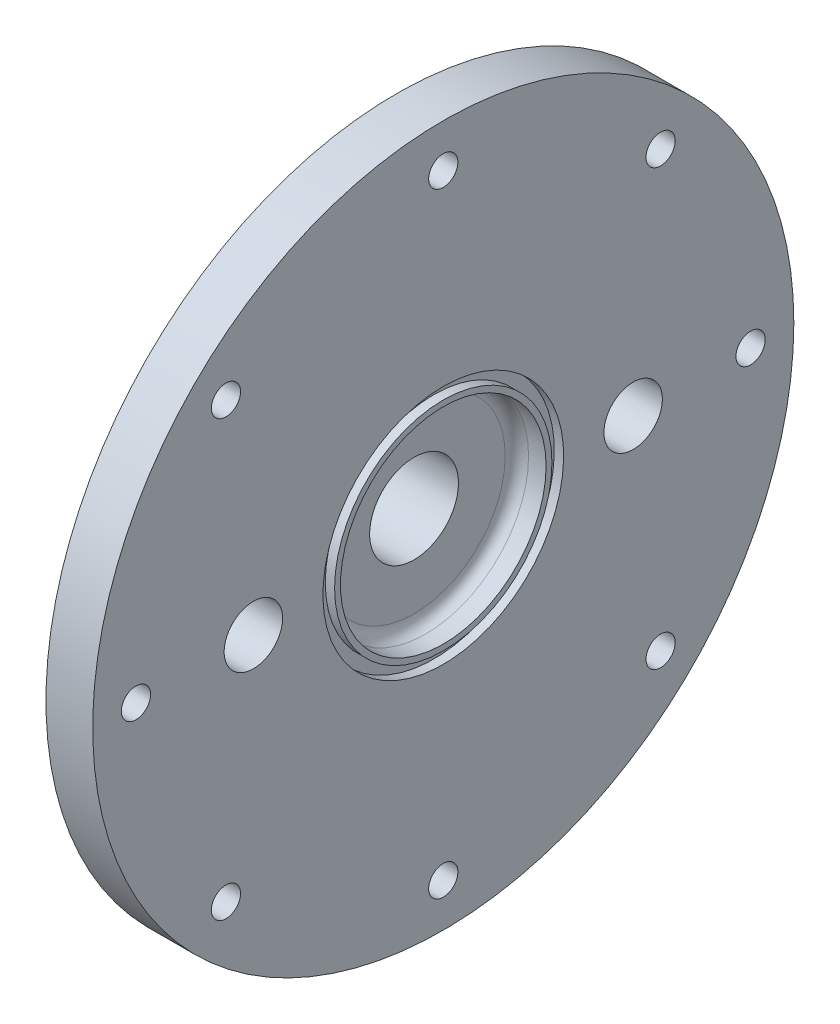
ISO-10303-21;
HEADER;
FILE_DESCRIPTION(('STEP AP214'),'2;1');
FILE_NAME('part.step','',(''),(''),'','','');
FILE_SCHEMA(('AUTOMOTIVE_DESIGN { 1 0 10303 214 1 1 1 1 }'));
ENDSEC;
DATA;
#1=APPLICATION_CONTEXT('core data for automotive mechanical design processes');
#2=APPLICATION_PROTOCOL_DEFINITION('international standard','automotive_design',2000,#1);
#3=PRODUCT_CONTEXT('',#1,'mechanical');
#4=PRODUCT('Part','Part','',(#3));
#5=PRODUCT_RELATED_PRODUCT_CATEGORY('part','',(#4));
#6=PRODUCT_DEFINITION_FORMATION('','',#4);
#7=PRODUCT_DEFINITION_CONTEXT('part definition',#1,'design');
#8=PRODUCT_DEFINITION('design','',#6,#7);
#9=PRODUCT_DEFINITION_SHAPE('','',#8);
#10=(LENGTH_UNIT() NAMED_UNIT(*) SI_UNIT(.MILLI.,.METRE.));
#11=(NAMED_UNIT(*) PLANE_ANGLE_UNIT() SI_UNIT($,.RADIAN.));
#12=(NAMED_UNIT(*) SI_UNIT($,.STERADIAN.) SOLID_ANGLE_UNIT());
#13=UNCERTAINTY_MEASURE_WITH_UNIT(LENGTH_MEASURE(1.E-05),#10,'distance_accuracy_value','');
#14=(GEOMETRIC_REPRESENTATION_CONTEXT(3) GLOBAL_UNCERTAINTY_ASSIGNED_CONTEXT((#13)) GLOBAL_UNIT_ASSIGNED_CONTEXT((#10,
#11,#12)) REPRESENTATION_CONTEXT('',''));
#15=CARTESIAN_POINT('',(0.,0.,0.));
#16=DIRECTION('',(0.,0.,1.));
#17=DIRECTION('',(1.,0.,0.));
#18=AXIS2_PLACEMENT_3D('',#15,#16,#17);
#19=CARTESIAN_POINT('',(0.,22.352,0.));
#20=DIRECTION('',(1.,0.,0.));
#21=DIRECTION('',(0.,0.,-1.));
#22=AXIS2_PLACEMENT_3D('',#19,#20,#21);
#23=PLANE('',#22);
#24=CARTESIAN_POINT('',(0.,0.,0.));
#25=DIRECTION('',(1.,0.,0.));
#26=DIRECTION('',(0.,0.,-1.));
#27=AXIS2_PLACEMENT_3D('',#24,#25,#26);
#28=CIRCLE('',#27,76.2);
#29=CARTESIAN_POINT('',(0.,0.,-76.2));
#30=VERTEX_POINT('',#29);
#31=EDGE_CURVE('E97',#30,#30,#28,.T.);
#32=ORIENTED_EDGE('',*,*,#31,.T.);
#33=EDGE_LOOP('',(#32));
#34=FACE_BOUND('',#33,.T.);
#35=CARTESIAN_POINT('',(0.,0.,41.275));
#36=DIRECTION('',(1.,0.,0.));
#37=DIRECTION('',(0.,0.,-1.));
#38=AXIS2_PLACEMENT_3D('',#35,#36,#37);
#39=CIRCLE('',#38,6.35);
#40=CARTESIAN_POINT('',(0.,0.,34.925));
#41=VERTEX_POINT('',#40);
#42=EDGE_CURVE('E55',#41,#41,#39,.T.);
#43=ORIENTED_EDGE('',*,*,#42,.F.);
#44=EDGE_LOOP('',(#43));
#45=FACE_BOUND('',#44,.T.);
#46=CARTESIAN_POINT('',(0.,0.,-41.275));
#47=DIRECTION('',(1.,0.,0.));
#48=DIRECTION('',(0.,0.,-1.));
#49=AXIS2_PLACEMENT_3D('',#46,#47,#48);
#50=CIRCLE('',#49,6.35);
#51=CARTESIAN_POINT('',(0.,0.,-47.625));
#52=VERTEX_POINT('',#51);
#53=EDGE_CURVE('E60',#52,#52,#50,.T.);
#54=ORIENTED_EDGE('',*,*,#53,.F.);
#55=EDGE_LOOP('',(#54));
#56=FACE_BOUND('',#55,.T.);
#57=CARTESIAN_POINT('',(0.,0.,-66.802));
#58=DIRECTION('',(1.,0.,0.));
#59=DIRECTION('',(0.,0.,-1.));
#60=AXIS2_PLACEMENT_3D('',#57,#58,#59);
#61=CIRCLE('',#60,3.175);
#62=CARTESIAN_POINT('',(0.,0.,-69.977));
#63=VERTEX_POINT('',#62);
#64=EDGE_CURVE('E63',#63,#63,#61,.T.);
#65=ORIENTED_EDGE('',*,*,#64,.F.);
#66=EDGE_LOOP('',(#65));
#67=FACE_BOUND('',#66,.T.);
#68=CARTESIAN_POINT('',(0.,47.2361471968238,-47.2361471968237));
#69=DIRECTION('',(1.,0.,0.));
#70=DIRECTION('',(0.,0.707106781186549,-0.707106781186546));
#71=AXIS2_PLACEMENT_3D('',#68,#69,#70);
#72=CIRCLE('',#71,3.175);
#73=CARTESIAN_POINT('',(0.,49.4812112270911,-49.481211227091));
#74=VERTEX_POINT('',#73);
#75=EDGE_CURVE('E68',#74,#74,#72,.T.);
#76=ORIENTED_EDGE('',*,*,#75,.F.);
#77=EDGE_LOOP('',(#76));
#78=FACE_BOUND('',#77,.T.);
#79=CARTESIAN_POINT('',(0.,-47.2361471968232,-47.2361471968243));
#80=DIRECTION('',(1.,0.,0.));
#81=DIRECTION('',(0.,-0.707106781186539,-0.707106781186556));
#82=AXIS2_PLACEMENT_3D('',#79,#80,#81);
#83=CIRCLE('',#82,3.175);
#84=CARTESIAN_POINT('',(0.,-49.4812112270904,-49.4812112270916));
#85=VERTEX_POINT('',#84);
#86=EDGE_CURVE('E154',#85,#85,#83,.T.);
#87=ORIENTED_EDGE('',*,*,#86,.F.);
#88=EDGE_LOOP('',(#87));
#89=FACE_BOUND('',#88,.T.);
#90=CARTESIAN_POINT('',(0.,-66.802,-6.99713809192197E-13));
#91=DIRECTION('',(1.,0.,0.));
#92=DIRECTION('',(0.,-1.,0.));
#93=AXIS2_PLACEMENT_3D('',#90,#91,#92);
#94=CIRCLE('',#93,3.175);
#95=CARTESIAN_POINT('',(0.,-69.977,-7.32970168944678E-13));
#96=VERTEX_POINT('',#95);
#97=EDGE_CURVE('E158',#96,#96,#94,.T.);
#98=ORIENTED_EDGE('',*,*,#97,.F.);
#99=EDGE_LOOP('',(#98));
#100=FACE_BOUND('',#99,.T.);
#101=CARTESIAN_POINT('',(0.,-47.2361471968242,47.2361471968233));
#102=DIRECTION('',(1.,0.,0.));
#103=DIRECTION('',(0.,-0.707106781186554,0.707106781186541));
#104=AXIS2_PLACEMENT_3D('',#101,#102,#103);
#105=CIRCLE('',#104,3.175);
#106=CARTESIAN_POINT('',(0.,-49.4812112270915,49.4812112270906));
#107=VERTEX_POINT('',#106);
#108=EDGE_CURVE('E162',#107,#107,#105,.T.);
#109=ORIENTED_EDGE('',*,*,#108,.F.);
#110=EDGE_LOOP('',(#109));
#111=FACE_BOUND('',#110,.T.);
#112=CARTESIAN_POINT('',(0.,0.,66.802));
#113=DIRECTION('',(1.,0.,0.));
#114=DIRECTION('',(0.,0.,1.));
#115=AXIS2_PLACEMENT_3D('',#112,#113,#114);
#116=CIRCLE('',#115,3.175);
#117=CARTESIAN_POINT('',(0.,0.,69.977));
#118=VERTEX_POINT('',#117);
#119=EDGE_CURVE('E166',#118,#118,#116,.T.);
#120=ORIENTED_EDGE('',*,*,#119,.F.);
#121=EDGE_LOOP('',(#120));
#122=FACE_BOUND('',#121,.T.);
#123=CARTESIAN_POINT('',(0.,47.2361471968235,47.236147196824));
#124=DIRECTION('',(1.,0.,0.));
#125=DIRECTION('',(0.,0.707106781186544,0.707106781186551));
#126=AXIS2_PLACEMENT_3D('',#123,#124,#125);
#127=CIRCLE('',#126,3.175);
#128=CARTESIAN_POINT('',(0.,49.4812112270908,49.4812112270913));
#129=VERTEX_POINT('',#128);
#130=EDGE_CURVE('E170',#129,#129,#127,.T.);
#131=ORIENTED_EDGE('',*,*,#130,.F.);
#132=EDGE_LOOP('',(#131));
#133=FACE_BOUND('',#132,.T.);
#134=CARTESIAN_POINT('',(0.,66.802,2.33237936397399E-13));
#135=DIRECTION('',(1.,0.,0.));
#136=DIRECTION('',(0.,1.,0.));
#137=AXIS2_PLACEMENT_3D('',#134,#135,#136);
#138=CIRCLE('',#137,3.175);
#139=CARTESIAN_POINT('',(0.,69.977,2.44323389648226E-13));
#140=VERTEX_POINT('',#139);
#141=EDGE_CURVE('E174',#140,#140,#138,.T.);
#142=ORIENTED_EDGE('',*,*,#141,.F.);
#143=EDGE_LOOP('',(#142));
#144=FACE_BOUND('',#143,.T.);
#145=CARTESIAN_POINT('',(0.,0.,0.));
#146=DIRECTION('',(1.,0.,0.));
#147=DIRECTION('',(0.,1.,0.));
#148=AXIS2_PLACEMENT_3D('',#145,#146,#147);
#149=CIRCLE('',#148,26.162);
#150=CARTESIAN_POINT('',(0.,26.162,0.));
#151=VERTEX_POINT('',#150);
#152=EDGE_CURVE('E177',#151,#151,#149,.T.);
#153=ORIENTED_EDGE('',*,*,#152,.F.);
#154=EDGE_LOOP('',(#153));
#155=FACE_BOUND('',#154,.T.);
#156=ADVANCED_FACE('F36',(#34,#45,#56,#67,#78,#89,#100,#111,#122,#133,#144,#155),#23,.T.);
#157=CARTESIAN_POINT('',(0.,0.,0.));
#158=DIRECTION('',(1.,0.,0.));
#159=DIRECTION('',(0.,0.,-1.));
#160=AXIS2_PLACEMENT_3D('',#157,#158,#159);
#161=CIRCLE('',#160,22.352);
#162=CARTESIAN_POINT('',(0.,0.,-22.352));
#163=VERTEX_POINT('',#162);
#164=EDGE_CURVE('E10',#163,#163,#161,.T.);
#165=ORIENTED_EDGE('',*,*,#164,.F.);
#166=EDGE_LOOP('',(#165));
#167=FACE_BOUND('',#166,.T.);
#168=CARTESIAN_POINT('',(0.,0.,0.));
#169=DIRECTION('',(1.,0.,0.));
#170=DIRECTION('',(0.,1.,0.));
#171=AXIS2_PLACEMENT_3D('',#168,#169,#170);
#172=CIRCLE('',#171,23.622);
#173=CARTESIAN_POINT('',(0.,23.622,0.));
#174=VERTEX_POINT('',#173);
#175=EDGE_CURVE('E384',#174,#174,#172,.T.);
#176=ORIENTED_EDGE('',*,*,#175,.T.);
#177=EDGE_LOOP('',(#176));
#178=FACE_BOUND('',#177,.T.);
#179=ADVANCED_FACE('F134',(#167,#178),#23,.T.);
#180=CARTESIAN_POINT('',(0.,0.,0.));
#181=DIRECTION('',(1.,0.,0.));
#182=DIRECTION('',(0.,0.,-1.));
#183=AXIS2_PLACEMENT_3D('',#180,#181,#182);
#184=CYLINDRICAL_SURFACE('',#183,22.352);
#185=ORIENTED_EDGE('',*,*,#164,.T.);
#186=EDGE_LOOP('',(#185));
#187=FACE_BOUND('',#186,.T.);
#188=CARTESIAN_POINT('',(-3.81,0.,0.));
#189=DIRECTION('',(1.,0.,0.));
#190=DIRECTION('',(0.,0.,-1.));
#191=AXIS2_PLACEMENT_3D('',#188,#189,#190);
#192=CIRCLE('',#191,22.352);
#193=CARTESIAN_POINT('',(-3.81,0.,-22.352));
#194=VERTEX_POINT('',#193);
#195=EDGE_CURVE('E43',#194,#194,#192,.T.);
#196=ORIENTED_EDGE('',*,*,#195,.F.);
#197=EDGE_LOOP('',(#196));
#198=FACE_BOUND('',#197,.T.);
#199=ADVANCED_FACE('F125',(#187,#198),#184,.F.);
#200=CARTESIAN_POINT('',(-3.81,0.,0.));
#201=DIRECTION('',(1.,0.,0.));
#202=DIRECTION('',(0.,0.,-1.));
#203=AXIS2_PLACEMENT_3D('',#200,#201,#202);
#204=TOROIDAL_SURFACE('',#203,19.812,2.54);
#205=ORIENTED_EDGE('',*,*,#195,.T.);
#206=EDGE_LOOP('',(#205));
#207=FACE_BOUND('',#206,.T.);
#208=CARTESIAN_POINT('',(-6.35,0.,0.));
#209=DIRECTION('',(1.,0.,0.));
#210=DIRECTION('',(0.,0.,-1.));
#211=AXIS2_PLACEMENT_3D('',#208,#209,#210);
#212=CIRCLE('',#211,19.812);
#213=CARTESIAN_POINT('',(-6.35,0.,-19.812));
#214=VERTEX_POINT('',#213);
#215=EDGE_CURVE('E48',#214,#214,#212,.T.);
#216=ORIENTED_EDGE('',*,*,#215,.F.);
#217=EDGE_LOOP('',(#216));
#218=FACE_BOUND('',#217,.T.);
#219=ADVANCED_FACE('F123',(#207,#218),#204,.F.);
#220=CARTESIAN_POINT('',(-6.35,9.652,0.));
#221=DIRECTION('',(1.,0.,0.));
#222=DIRECTION('',(0.,0.,-1.));
#223=AXIS2_PLACEMENT_3D('',#220,#221,#222);
#224=PLANE('',#223);
#225=ORIENTED_EDGE('',*,*,#215,.T.);
#226=EDGE_LOOP('',(#225));
#227=FACE_BOUND('',#226,.T.);
#228=CARTESIAN_POINT('',(-6.35,0.,0.));
#229=DIRECTION('',(1.,0.,0.));
#230=DIRECTION('',(0.,0.,-1.));
#231=AXIS2_PLACEMENT_3D('',#228,#229,#230);
#232=CIRCLE('',#231,9.652);
#233=CARTESIAN_POINT('',(-6.35,0.,-9.652));
#234=VERTEX_POINT('',#233);
#235=EDGE_CURVE('E115',#234,#234,#232,.T.);
#236=ORIENTED_EDGE('',*,*,#235,.F.);
#237=EDGE_LOOP('',(#236));
#238=FACE_BOUND('',#237,.T.);
#239=ADVANCED_FACE('F120',(#227,#238),#224,.T.);
#240=CARTESIAN_POINT('',(0.,0.,0.));
#241=DIRECTION('',(1.,0.,0.));
#242=DIRECTION('',(0.,0.,-1.));
#243=AXIS2_PLACEMENT_3D('',#240,#241,#242);
#244=CYLINDRICAL_SURFACE('',#243,9.652);
#245=ORIENTED_EDGE('',*,*,#235,.T.);
#246=EDGE_LOOP('',(#245));
#247=FACE_BOUND('',#246,.T.);
#248=CARTESIAN_POINT('',(-31.75,0.,0.));
#249=DIRECTION('',(1.,0.,0.));
#250=DIRECTION('',(0.,0.,-1.));
#251=AXIS2_PLACEMENT_3D('',#248,#249,#250);
#252=CIRCLE('',#251,9.652);
#253=CARTESIAN_POINT('',(-31.75,0.,-9.652));
#254=VERTEX_POINT('',#253);
#255=EDGE_CURVE('E112',#254,#254,#252,.T.);
#256=ORIENTED_EDGE('',*,*,#255,.F.);
#257=EDGE_LOOP('',(#256));
#258=FACE_BOUND('',#257,.T.);
#259=ADVANCED_FACE('F132',(#247,#258),#244,.F.);
#260=CARTESIAN_POINT('',(-31.75,16.002,0.));
#261=DIRECTION('',(-1.,0.,0.));
#262=DIRECTION('',(0.,0.,1.));
#263=AXIS2_PLACEMENT_3D('',#260,#261,#262);
#264=PLANE('',#263);
#265=ORIENTED_EDGE('',*,*,#255,.T.);
#266=EDGE_LOOP('',(#265));
#267=FACE_BOUND('',#266,.T.);
#268=CARTESIAN_POINT('',(-31.75,0.,0.));
#269=DIRECTION('',(1.,0.,0.));
#270=DIRECTION('',(0.,0.,-1.));
#271=AXIS2_PLACEMENT_3D('',#268,#269,#270);
#272=CIRCLE('',#271,16.002);
#273=CARTESIAN_POINT('',(-31.75,0.,-16.002));
#274=VERTEX_POINT('',#273);
#275=EDGE_CURVE('E109',#274,#274,#272,.T.);
#276=ORIENTED_EDGE('',*,*,#275,.F.);
#277=EDGE_LOOP('',(#276));
#278=FACE_BOUND('',#277,.T.);
#279=ADVANCED_FACE('F240',(#267,#278),#264,.T.);
#280=CARTESIAN_POINT('',(0.,0.,0.));
#281=DIRECTION('',(1.,0.,0.));
#282=DIRECTION('',(0.,0.,-1.));
#283=AXIS2_PLACEMENT_3D('',#280,#281,#282);
#284=CYLINDRICAL_SURFACE('',#283,16.002);
#285=ORIENTED_EDGE('',*,*,#275,.T.);
#286=EDGE_LOOP('',(#285));
#287=FACE_BOUND('',#286,.T.);
#288=CARTESIAN_POINT('',(-15.24,0.,0.));
#289=DIRECTION('',(1.,0.,0.));
#290=DIRECTION('',(0.,0.,-1.));
#291=AXIS2_PLACEMENT_3D('',#288,#289,#290);
#292=CIRCLE('',#291,16.002);
#293=CARTESIAN_POINT('',(-15.24,0.,-16.002));
#294=VERTEX_POINT('',#293);
#295=EDGE_CURVE('E106',#294,#294,#292,.T.);
#296=ORIENTED_EDGE('',*,*,#295,.F.);
#297=EDGE_LOOP('',(#296));
#298=FACE_BOUND('',#297,.T.);
#299=ADVANCED_FACE('F236',(#287,#298),#284,.T.);
#300=CARTESIAN_POINT('',(-15.24,0.,0.));
#301=DIRECTION('',(1.,0.,0.));
#302=DIRECTION('',(0.,0.,-1.));
#303=AXIS2_PLACEMENT_3D('',#300,#301,#302);
#304=TOROIDAL_SURFACE('',#303,21.082,5.08);
#305=ORIENTED_EDGE('',*,*,#295,.T.);
#306=EDGE_LOOP('',(#305));
#307=FACE_BOUND('',#306,.T.);
#308=CARTESIAN_POINT('',(-10.16,0.,0.));
#309=DIRECTION('',(1.,0.,0.));
#310=DIRECTION('',(0.,0.,-1.));
#311=AXIS2_PLACEMENT_3D('',#308,#309,#310);
#312=CIRCLE('',#311,21.082);
#313=CARTESIAN_POINT('',(-10.16,0.,-21.082));
#314=VERTEX_POINT('',#313);
#315=EDGE_CURVE('E103',#314,#314,#312,.T.);
#316=ORIENTED_EDGE('',*,*,#315,.F.);
#317=EDGE_LOOP('',(#316));
#318=FACE_BOUND('',#317,.T.);
#319=ADVANCED_FACE('F232',(#307,#318),#304,.F.);
#320=CARTESIAN_POINT('',(-10.16,76.2,0.));
#321=DIRECTION('',(-1.,0.,0.));
#322=DIRECTION('',(0.,0.,1.));
#323=AXIS2_PLACEMENT_3D('',#320,#321,#322);
#324=PLANE('',#323);
#325=CARTESIAN_POINT('',(-10.16,66.802,2.33237936397399E-13));
#326=DIRECTION('',(-1.,0.,0.));
#327=DIRECTION('',(0.,0.,1.));
#328=AXIS2_PLACEMENT_3D('',#325,#326,#327);
#329=CIRCLE('',#328,3.175);
#330=CARTESIAN_POINT('',(-10.16,66.802,3.17500000000023));
#331=VERTEX_POINT('',#330);
#332=EDGE_CURVE('E39',#331,#331,#329,.T.);
#333=ORIENTED_EDGE('',*,*,#332,.F.);
#334=EDGE_LOOP('',(#333));
#335=FACE_BOUND('',#334,.T.);
#336=CARTESIAN_POINT('',(-10.16,47.2361471968235,47.236147196824));
#337=DIRECTION('',(-1.,0.,0.));
#338=DIRECTION('',(0.,0.,1.));
#339=AXIS2_PLACEMENT_3D('',#336,#337,#338);
#340=CIRCLE('',#339,3.175);
#341=CARTESIAN_POINT('',(-10.16,47.2361471968235,50.411147196824));
#342=VERTEX_POINT('',#341);
#343=EDGE_CURVE('E79',#342,#342,#340,.T.);
#344=ORIENTED_EDGE('',*,*,#343,.F.);
#345=EDGE_LOOP('',(#344));
#346=FACE_BOUND('',#345,.T.);
#347=CARTESIAN_POINT('',(-10.16,0.,66.802));
#348=DIRECTION('',(-1.,0.,0.));
#349=DIRECTION('',(0.,0.,1.));
#350=AXIS2_PLACEMENT_3D('',#347,#348,#349);
#351=CIRCLE('',#350,3.175);
#352=CARTESIAN_POINT('',(-10.16,0.,69.977));
#353=VERTEX_POINT('',#352);
#354=EDGE_CURVE('E77',#353,#353,#351,.T.);
#355=ORIENTED_EDGE('',*,*,#354,.F.);
#356=EDGE_LOOP('',(#355));
#357=FACE_BOUND('',#356,.T.);
#358=CARTESIAN_POINT('',(-10.16,-47.2361471968242,47.2361471968233));
#359=DIRECTION('',(-1.,0.,0.));
#360=DIRECTION('',(0.,0.,1.));
#361=AXIS2_PLACEMENT_3D('',#358,#359,#360);
#362=CIRCLE('',#361,3.175);
#363=CARTESIAN_POINT('',(-10.16,-47.2361471968242,50.4111471968233));
#364=VERTEX_POINT('',#363);
#365=EDGE_CURVE('E74',#364,#364,#362,.T.);
#366=ORIENTED_EDGE('',*,*,#365,.F.);
#367=EDGE_LOOP('',(#366));
#368=FACE_BOUND('',#367,.T.);
#369=CARTESIAN_POINT('',(-10.16,-66.802,-6.99713809192197E-13));
#370=DIRECTION('',(-1.,0.,0.));
#371=DIRECTION('',(0.,0.,1.));
#372=AXIS2_PLACEMENT_3D('',#369,#370,#371);
#373=CIRCLE('',#372,3.175);
#374=CARTESIAN_POINT('',(-10.16,-66.802,3.1749999999993));
#375=VERTEX_POINT('',#374);
#376=EDGE_CURVE('E71',#375,#375,#373,.T.);
#377=ORIENTED_EDGE('',*,*,#376,.F.);
#378=EDGE_LOOP('',(#377));
#379=FACE_BOUND('',#378,.T.);
#380=CARTESIAN_POINT('',(-10.16,-47.2361471968232,-47.2361471968243));
#381=DIRECTION('',(-1.,0.,0.));
#382=DIRECTION('',(0.,0.,1.));
#383=AXIS2_PLACEMENT_3D('',#380,#381,#382);
#384=CIRCLE('',#383,3.175);
#385=CARTESIAN_POINT('',(-10.16,-47.2361471968232,-44.0611471968243));
#386=VERTEX_POINT('',#385);
#387=EDGE_CURVE('E67',#386,#386,#384,.T.);
#388=ORIENTED_EDGE('',*,*,#387,.F.);
#389=EDGE_LOOP('',(#388));
#390=FACE_BOUND('',#389,.T.);
#391=CARTESIAN_POINT('',(-10.16,47.2361471968238,-47.2361471968237));
#392=DIRECTION('',(-1.,0.,0.));
#393=DIRECTION('',(0.,0.,1.));
#394=AXIS2_PLACEMENT_3D('',#391,#392,#393);
#395=CIRCLE('',#394,3.175);
#396=CARTESIAN_POINT('',(-10.16,47.2361471968238,-44.0611471968237));
#397=VERTEX_POINT('',#396);
#398=EDGE_CURVE('E64',#397,#397,#395,.T.);
#399=ORIENTED_EDGE('',*,*,#398,.F.);
#400=EDGE_LOOP('',(#399));
#401=FACE_BOUND('',#400,.T.);
#402=CARTESIAN_POINT('',(-10.16,0.,-66.802));
#403=DIRECTION('',(-1.,0.,0.));
#404=DIRECTION('',(0.,0.,1.));
#405=AXIS2_PLACEMENT_3D('',#402,#403,#404);
#406=CIRCLE('',#405,3.175);
#407=CARTESIAN_POINT('',(-10.16,0.,-63.627));
#408=VERTEX_POINT('',#407);
#409=EDGE_CURVE('E56',#408,#408,#406,.T.);
#410=ORIENTED_EDGE('',*,*,#409,.F.);
#411=EDGE_LOOP('',(#410));
#412=FACE_BOUND('',#411,.T.);
#413=CARTESIAN_POINT('',(-10.16,0.,-41.275));
#414=DIRECTION('',(-1.,0.,0.));
#415=DIRECTION('',(0.,0.,1.));
#416=AXIS2_PLACEMENT_3D('',#413,#414,#415);
#417=CIRCLE('',#416,6.35);
#418=CARTESIAN_POINT('',(-10.16,0.,-34.925));
#419=VERTEX_POINT('',#418);
#420=EDGE_CURVE('E57',#419,#419,#417,.T.);
#421=ORIENTED_EDGE('',*,*,#420,.F.);
#422=EDGE_LOOP('',(#421));
#423=FACE_BOUND('',#422,.T.);
#424=CARTESIAN_POINT('',(-10.16,0.,41.275));
#425=DIRECTION('',(-1.,0.,0.));
#426=DIRECTION('',(0.,0.,1.));
#427=AXIS2_PLACEMENT_3D('',#424,#425,#426);
#428=CIRCLE('',#427,6.35);
#429=CARTESIAN_POINT('',(-10.16,0.,47.625));
#430=VERTEX_POINT('',#429);
#431=EDGE_CURVE('E52',#430,#430,#428,.T.);
#432=ORIENTED_EDGE('',*,*,#431,.F.);
#433=EDGE_LOOP('',(#432));
#434=FACE_BOUND('',#433,.T.);
#435=ORIENTED_EDGE('',*,*,#315,.T.);
#436=EDGE_LOOP('',(#435));
#437=FACE_BOUND('',#436,.T.);
#438=CARTESIAN_POINT('',(-10.16,0.,0.));
#439=DIRECTION('',(1.,0.,0.));
#440=DIRECTION('',(0.,0.,-1.));
#441=AXIS2_PLACEMENT_3D('',#438,#439,#440);
#442=CIRCLE('',#441,76.2);
#443=CARTESIAN_POINT('',(-10.16,0.,-76.2));
#444=VERTEX_POINT('',#443);
#445=EDGE_CURVE('E100',#444,#444,#442,.T.);
#446=ORIENTED_EDGE('',*,*,#445,.F.);
#447=EDGE_LOOP('',(#446));
#448=FACE_BOUND('',#447,.T.);
#449=ADVANCED_FACE('F228',(#335,#346,#357,#368,#379,#390,#401,#412,#423,#434,#437,#448),#324,.T.);
#450=CARTESIAN_POINT('',(0.,0.,0.));
#451=DIRECTION('',(1.,0.,0.));
#452=DIRECTION('',(0.,0.,-1.));
#453=AXIS2_PLACEMENT_3D('',#450,#451,#452);
#454=CYLINDRICAL_SURFACE('',#453,76.2);
#455=ORIENTED_EDGE('',*,*,#445,.T.);
#456=EDGE_LOOP('',(#455));
#457=FACE_BOUND('',#456,.T.);
#458=ORIENTED_EDGE('',*,*,#31,.F.);
#459=EDGE_LOOP('',(#458));
#460=FACE_BOUND('',#459,.T.);
#461=ADVANCED_FACE('F224',(#457,#460),#454,.T.);
#462=CARTESIAN_POINT('',(-31.75,0.,41.275));
#463=DIRECTION('',(1.,0.,0.));
#464=DIRECTION('',(0.,0.,-1.));
#465=AXIS2_PLACEMENT_3D('',#462,#463,#464);
#466=CYLINDRICAL_SURFACE('',#465,6.35);
#467=ORIENTED_EDGE('',*,*,#42,.T.);
#468=EDGE_LOOP('',(#467));
#469=FACE_BOUND('',#468,.T.);
#470=ORIENTED_EDGE('',*,*,#431,.T.);
#471=EDGE_LOOP('',(#470));
#472=FACE_BOUND('',#471,.T.);
#473=ADVANCED_FACE('F220',(#469,#472),#466,.F.);
#474=CARTESIAN_POINT('',(-31.75,0.,-41.275));
#475=DIRECTION('',(1.,0.,0.));
#476=DIRECTION('',(0.,0.,-1.));
#477=AXIS2_PLACEMENT_3D('',#474,#475,#476);
#478=CYLINDRICAL_SURFACE('',#477,6.35);
#479=ORIENTED_EDGE('',*,*,#53,.T.);
#480=EDGE_LOOP('',(#479));
#481=FACE_BOUND('',#480,.T.);
#482=ORIENTED_EDGE('',*,*,#420,.T.);
#483=EDGE_LOOP('',(#482));
#484=FACE_BOUND('',#483,.T.);
#485=ADVANCED_FACE('F216',(#481,#484),#478,.F.);
#486=CARTESIAN_POINT('',(-31.75,0.,-66.802));
#487=DIRECTION('',(1.,0.,0.));
#488=DIRECTION('',(0.,0.,-1.));
#489=AXIS2_PLACEMENT_3D('',#486,#487,#488);
#490=CYLINDRICAL_SURFACE('',#489,3.175);
#491=ORIENTED_EDGE('',*,*,#409,.T.);
#492=EDGE_LOOP('',(#491));
#493=FACE_BOUND('',#492,.T.);
#494=ORIENTED_EDGE('',*,*,#64,.T.);
#495=EDGE_LOOP('',(#494));
#496=FACE_BOUND('',#495,.T.);
#497=ADVANCED_FACE('F212',(#493,#496),#490,.F.);
#498=CARTESIAN_POINT('',(-31.75,47.2361471968238,-47.2361471968237));
#499=DIRECTION('',(1.,0.,0.));
#500=DIRECTION('',(0.,0.,-1.));
#501=AXIS2_PLACEMENT_3D('',#498,#499,#500);
#502=CYLINDRICAL_SURFACE('',#501,3.175);
#503=ORIENTED_EDGE('',*,*,#398,.T.);
#504=EDGE_LOOP('',(#503));
#505=FACE_BOUND('',#504,.T.);
#506=ORIENTED_EDGE('',*,*,#75,.T.);
#507=EDGE_LOOP('',(#506));
#508=FACE_BOUND('',#507,.T.);
#509=ADVANCED_FACE('F209',(#505,#508),#502,.F.);
#510=CARTESIAN_POINT('',(-31.75,-47.2361471968232,-47.2361471968243));
#511=DIRECTION('',(1.,0.,0.));
#512=DIRECTION('',(0.,0.,-1.));
#513=AXIS2_PLACEMENT_3D('',#510,#511,#512);
#514=CYLINDRICAL_SURFACE('',#513,3.175);
#515=ORIENTED_EDGE('',*,*,#387,.T.);
#516=EDGE_LOOP('',(#515));
#517=FACE_BOUND('',#516,.T.);
#518=ORIENTED_EDGE('',*,*,#86,.T.);
#519=EDGE_LOOP('',(#518));
#520=FACE_BOUND('',#519,.T.);
#521=ADVANCED_FACE('F204',(#517,#520),#514,.F.);
#522=CARTESIAN_POINT('',(-31.75,-66.802,-6.99713809192197E-13));
#523=DIRECTION('',(1.,0.,0.));
#524=DIRECTION('',(0.,0.,-1.));
#525=AXIS2_PLACEMENT_3D('',#522,#523,#524);
#526=CYLINDRICAL_SURFACE('',#525,3.175);
#527=ORIENTED_EDGE('',*,*,#376,.T.);
#528=EDGE_LOOP('',(#527));
#529=FACE_BOUND('',#528,.T.);
#530=ORIENTED_EDGE('',*,*,#97,.T.);
#531=EDGE_LOOP('',(#530));
#532=FACE_BOUND('',#531,.T.);
#533=ADVANCED_FACE('F194',(#529,#532),#526,.F.);
#534=CARTESIAN_POINT('',(-31.75,-47.2361471968242,47.2361471968233));
#535=DIRECTION('',(1.,0.,0.));
#536=DIRECTION('',(0.,0.,-1.));
#537=AXIS2_PLACEMENT_3D('',#534,#535,#536);
#538=CYLINDRICAL_SURFACE('',#537,3.175);
#539=ORIENTED_EDGE('',*,*,#365,.T.);
#540=EDGE_LOOP('',(#539));
#541=FACE_BOUND('',#540,.T.);
#542=ORIENTED_EDGE('',*,*,#108,.T.);
#543=EDGE_LOOP('',(#542));
#544=FACE_BOUND('',#543,.T.);
#545=ADVANCED_FACE('F191',(#541,#544),#538,.F.);
#546=CARTESIAN_POINT('',(-31.75,0.,66.802));
#547=DIRECTION('',(1.,0.,0.));
#548=DIRECTION('',(0.,0.,-1.));
#549=AXIS2_PLACEMENT_3D('',#546,#547,#548);
#550=CYLINDRICAL_SURFACE('',#549,3.175);
#551=ORIENTED_EDGE('',*,*,#354,.T.);
#552=EDGE_LOOP('',(#551));
#553=FACE_BOUND('',#552,.T.);
#554=ORIENTED_EDGE('',*,*,#119,.T.);
#555=EDGE_LOOP('',(#554));
#556=FACE_BOUND('',#555,.T.);
#557=ADVANCED_FACE('F193',(#553,#556),#550,.F.);
#558=CARTESIAN_POINT('',(-31.75,47.2361471968235,47.236147196824));
#559=DIRECTION('',(1.,0.,0.));
#560=DIRECTION('',(0.,0.,-1.));
#561=AXIS2_PLACEMENT_3D('',#558,#559,#560);
#562=CYLINDRICAL_SURFACE('',#561,3.175);
#563=ORIENTED_EDGE('',*,*,#343,.T.);
#564=EDGE_LOOP('',(#563));
#565=FACE_BOUND('',#564,.T.);
#566=ORIENTED_EDGE('',*,*,#130,.T.);
#567=EDGE_LOOP('',(#566));
#568=FACE_BOUND('',#567,.T.);
#569=ADVANCED_FACE('F201',(#565,#568),#562,.F.);
#570=CARTESIAN_POINT('',(-31.75,66.802,2.33237936397399E-13));
#571=DIRECTION('',(1.,0.,0.));
#572=DIRECTION('',(0.,0.,-1.));
#573=AXIS2_PLACEMENT_3D('',#570,#571,#572);
#574=CYLINDRICAL_SURFACE('',#573,3.175);
#575=ORIENTED_EDGE('',*,*,#332,.T.);
#576=EDGE_LOOP('',(#575));
#577=FACE_BOUND('',#576,.T.);
#578=ORIENTED_EDGE('',*,*,#141,.T.);
#579=EDGE_LOOP('',(#578));
#580=FACE_BOUND('',#579,.T.);
#581=ADVANCED_FACE('F330',(#577,#580),#574,.F.);
#582=CARTESIAN_POINT('',(0.,0.,0.));
#583=DIRECTION('',(1.,0.,0.));
#584=DIRECTION('',(0.,1.,0.));
#585=AXIS2_PLACEMENT_3D('',#582,#583,#584);
#586=CYLINDRICAL_SURFACE('',#585,26.162);
#587=CARTESIAN_POINT('',(-2.03200000000002,0.,0.));
#588=DIRECTION('',(1.,0.,0.));
#589=DIRECTION('',(0.,1.,0.));
#590=AXIS2_PLACEMENT_3D('',#587,#588,#589);
#591=CIRCLE('',#590,26.162);
#592=CARTESIAN_POINT('',(-2.032,26.162,0.));
#593=VERTEX_POINT('',#592);
#594=EDGE_CURVE('E179',#593,#593,#591,.T.);
#595=ORIENTED_EDGE('',*,*,#594,.F.);
#596=EDGE_LOOP('',(#595));
#597=FACE_BOUND('',#596,.T.);
#598=ORIENTED_EDGE('',*,*,#152,.T.);
#599=EDGE_LOOP('',(#598));
#600=FACE_BOUND('',#599,.T.);
#601=ADVANCED_FACE('F337',(#597,#600),#586,.F.);
#602=CARTESIAN_POINT('',(-2.032,23.622,0.));
#603=DIRECTION('',(-1.,0.,0.));
#604=DIRECTION('',(0.,-1.,0.));
#605=AXIS2_PLACEMENT_3D('',#602,#603,#604);
#606=PLANE('',#605);
#607=CARTESIAN_POINT('',(-2.03200000000002,0.,0.));
#608=DIRECTION('',(1.,0.,0.));
#609=DIRECTION('',(0.,1.,0.));
#610=AXIS2_PLACEMENT_3D('',#607,#608,#609);
#611=CIRCLE('',#610,23.622);
#612=CARTESIAN_POINT('',(-2.032,23.622,0.));
#613=VERTEX_POINT('',#612);
#614=EDGE_CURVE('E183',#613,#613,#611,.T.);
#615=ORIENTED_EDGE('',*,*,#614,.F.);
#616=EDGE_LOOP('',(#615));
#617=FACE_BOUND('',#616,.T.);
#618=ORIENTED_EDGE('',*,*,#594,.T.);
#619=EDGE_LOOP('',(#618));
#620=FACE_BOUND('',#619,.T.);
#621=ADVANCED_FACE('F357',(#617,#620),#606,.F.);
#622=CARTESIAN_POINT('',(0.,0.,0.));
#623=DIRECTION('',(1.,0.,0.));
#624=DIRECTION('',(0.,1.,0.));
#625=AXIS2_PLACEMENT_3D('',#622,#623,#624);
#626=CYLINDRICAL_SURFACE('',#625,23.622);
#627=ORIENTED_EDGE('',*,*,#175,.F.);
#628=EDGE_LOOP('',(#627));
#629=FACE_BOUND('',#628,.T.);
#630=ORIENTED_EDGE('',*,*,#614,.T.);
#631=EDGE_LOOP('',(#630));
#632=FACE_BOUND('',#631,.T.);
#633=ADVANCED_FACE('F367',(#629,#632),#626,.T.);
#634=CLOSED_SHELL('',(#156,#179,#199,#219,#239,#259,#279,#299,#319,#449,#461,#473,#485,#497,
#509,#521,#533,#545,#557,#569,#581,#601,#621,#633));
#635=MANIFOLD_SOLID_BREP('B2',#634);
#636=ADVANCED_BREP_SHAPE_REPRESENTATION('',(#18,#635),#14);
#637=SHAPE_DEFINITION_REPRESENTATION(#9,#636);
ENDSEC;
END-ISO-10303-21;
